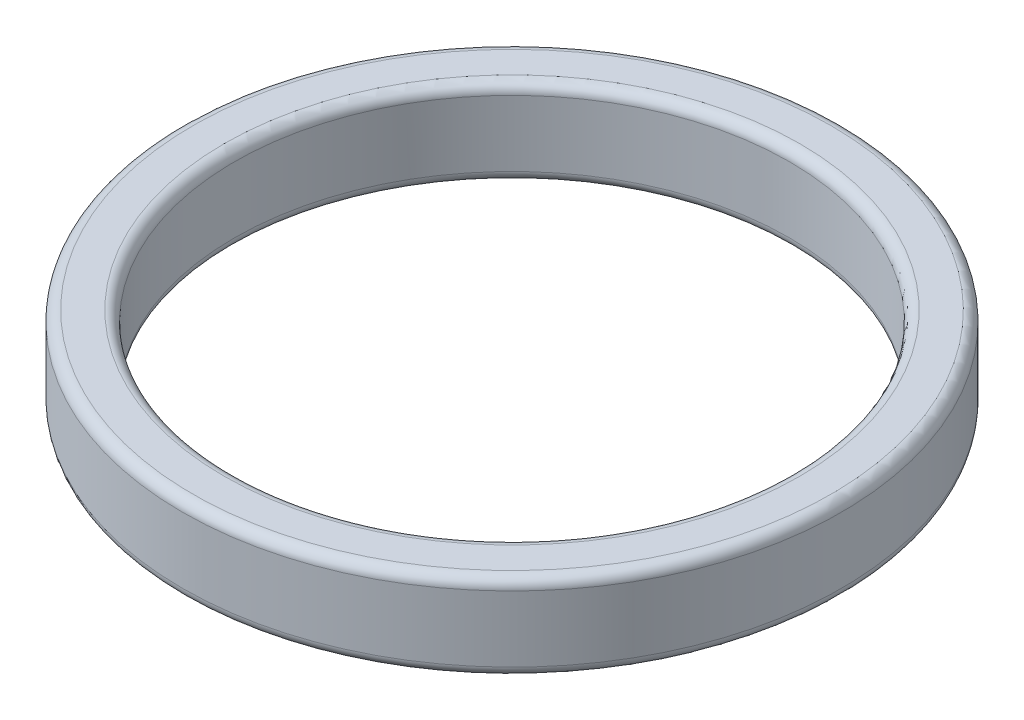
ISO-10303-21;
HEADER;
FILE_DESCRIPTION(('STEP AP214'),'2;1');
FILE_NAME('part.step','',(''),(''),'','','');
FILE_SCHEMA(('AUTOMOTIVE_DESIGN { 1 0 10303 214 1 1 1 1 }'));
ENDSEC;
DATA;
#1=APPLICATION_CONTEXT('core data for automotive mechanical design processes');
#2=APPLICATION_PROTOCOL_DEFINITION('international standard','automotive_design',2000,#1);
#3=PRODUCT_CONTEXT('',#1,'mechanical');
#4=PRODUCT('Part','Part','',(#3));
#5=PRODUCT_RELATED_PRODUCT_CATEGORY('part','',(#4));
#6=PRODUCT_DEFINITION_FORMATION('','',#4);
#7=PRODUCT_DEFINITION_CONTEXT('part definition',#1,'design');
#8=PRODUCT_DEFINITION('design','',#6,#7);
#9=PRODUCT_DEFINITION_SHAPE('','',#8);
#10=(LENGTH_UNIT() NAMED_UNIT(*) SI_UNIT(.MILLI.,.METRE.));
#11=(NAMED_UNIT(*) PLANE_ANGLE_UNIT() SI_UNIT($,.RADIAN.));
#12=(NAMED_UNIT(*) SI_UNIT($,.STERADIAN.) SOLID_ANGLE_UNIT());
#13=UNCERTAINTY_MEASURE_WITH_UNIT(LENGTH_MEASURE(1.E-05),#10,'distance_accuracy_value','');
#14=(GEOMETRIC_REPRESENTATION_CONTEXT(3) GLOBAL_UNCERTAINTY_ASSIGNED_CONTEXT((#13)) GLOBAL_UNIT_ASSIGNED_CONTEXT((#10,
#11,#12)) REPRESENTATION_CONTEXT('',''));
#15=CARTESIAN_POINT('',(0.,0.,0.));
#16=DIRECTION('',(0.,0.,1.));
#17=DIRECTION('',(1.,0.,0.));
#18=AXIS2_PLACEMENT_3D('',#15,#16,#17);
#19=CARTESIAN_POINT('',(0.,0.,0.));
#20=DIRECTION('',(0.,-1.,0.));
#21=DIRECTION('',(0.,0.,-1.));
#22=AXIS2_PLACEMENT_3D('',#19,#20,#21);
#23=CYLINDRICAL_SURFACE('',#22,9.5);
#24=CARTESIAN_POINT('',(0.,0.3,0.));
#25=DIRECTION('',(0.,1.,0.));
#26=DIRECTION('',(0.,0.,1.));
#27=AXIS2_PLACEMENT_3D('',#24,#25,#26);
#28=CIRCLE('',#27,9.5);
#29=CARTESIAN_POINT('',(0.,0.3,9.5));
#30=VERTEX_POINT('',#29);
#31=EDGE_CURVE('E57',#30,#30,#28,.T.);
#32=ORIENTED_EDGE('',*,*,#31,.T.);
#33=EDGE_LOOP('',(#32));
#34=FACE_BOUND('',#33,.T.);
#35=CARTESIAN_POINT('',(0.,2.2,0.));
#36=DIRECTION('',(0.,-1.,0.));
#37=DIRECTION('',(0.,0.,-1.));
#38=AXIS2_PLACEMENT_3D('',#35,#36,#37);
#39=CIRCLE('',#38,9.5);
#40=CARTESIAN_POINT('',(0.,2.2,-9.5));
#41=VERTEX_POINT('',#40);
#42=EDGE_CURVE('E60',#41,#41,#39,.T.);
#43=ORIENTED_EDGE('',*,*,#42,.T.);
#44=EDGE_LOOP('',(#43));
#45=FACE_BOUND('',#44,.T.);
#46=ADVANCED_FACE('F37',(#34,#45),#23,.T.);
#47=CARTESIAN_POINT('',(-9.5,0.,0.));
#48=DIRECTION('',(0.,1.,0.));
#49=DIRECTION('',(0.,0.,1.));
#50=AXIS2_PLACEMENT_3D('',#47,#48,#49);
#51=PLANE('',#50);
#52=CARTESIAN_POINT('',(0.,0.,0.));
#53=DIRECTION('',(0.,1.,0.));
#54=DIRECTION('',(0.,0.,1.));
#55=AXIS2_PLACEMENT_3D('',#52,#53,#54);
#56=CIRCLE('',#55,9.2);
#57=CARTESIAN_POINT('',(0.,0.,9.2));
#58=VERTEX_POINT('',#57);
#59=EDGE_CURVE('E63',#58,#58,#56,.F.);
#60=ORIENTED_EDGE('',*,*,#59,.T.);
#61=EDGE_LOOP('',(#60));
#62=FACE_BOUND('',#61,.T.);
#63=CARTESIAN_POINT('',(0.,0.,0.));
#64=DIRECTION('',(0.,1.,0.));
#65=DIRECTION('',(0.,0.,1.));
#66=AXIS2_PLACEMENT_3D('',#63,#64,#65);
#67=CIRCLE('',#66,8.3);
#68=CARTESIAN_POINT('',(0.,0.,8.3));
#69=VERTEX_POINT('',#68);
#70=EDGE_CURVE('E66',#69,#69,#67,.T.);
#71=ORIENTED_EDGE('',*,*,#70,.T.);
#72=EDGE_LOOP('',(#71));
#73=FACE_BOUND('',#72,.T.);
#74=ADVANCED_FACE('F70',(#62,#73),#51,.F.);
#75=CARTESIAN_POINT('',(0.,0.,0.));
#76=DIRECTION('',(0.,-1.,0.));
#77=DIRECTION('',(0.,0.,-1.));
#78=AXIS2_PLACEMENT_3D('',#75,#76,#77);
#79=CYLINDRICAL_SURFACE('',#78,8.);
#80=CARTESIAN_POINT('',(0.,0.3,0.));
#81=DIRECTION('',(0.,1.,0.));
#82=DIRECTION('',(0.,0.,1.));
#83=AXIS2_PLACEMENT_3D('',#80,#81,#82);
#84=CIRCLE('',#83,8.);
#85=CARTESIAN_POINT('',(0.,0.3,8.));
#86=VERTEX_POINT('',#85);
#87=EDGE_CURVE('E48',#86,#86,#84,.F.);
#88=ORIENTED_EDGE('',*,*,#87,.T.);
#89=EDGE_LOOP('',(#88));
#90=FACE_BOUND('',#89,.T.);
#91=CARTESIAN_POINT('',(0.,2.2,0.));
#92=DIRECTION('',(0.,-1.,0.));
#93=DIRECTION('',(0.,0.,-1.));
#94=AXIS2_PLACEMENT_3D('',#91,#92,#93);
#95=CIRCLE('',#94,8.);
#96=CARTESIAN_POINT('',(0.,2.2,-8.));
#97=VERTEX_POINT('',#96);
#98=EDGE_CURVE('E52',#97,#97,#95,.F.);
#99=ORIENTED_EDGE('',*,*,#98,.T.);
#100=EDGE_LOOP('',(#99));
#101=FACE_BOUND('',#100,.T.);
#102=ADVANCED_FACE('F80',(#90,#101),#79,.F.);
#103=CARTESIAN_POINT('',(-9.5,2.5,0.));
#104=DIRECTION('',(0.,-1.,0.));
#105=DIRECTION('',(0.,0.,-1.));
#106=AXIS2_PLACEMENT_3D('',#103,#104,#105);
#107=PLANE('',#106);
#108=CARTESIAN_POINT('',(0.,2.5,0.));
#109=DIRECTION('',(0.,-1.,0.));
#110=DIRECTION('',(0.,0.,-1.));
#111=AXIS2_PLACEMENT_3D('',#108,#109,#110);
#112=CIRCLE('',#111,9.2);
#113=CARTESIAN_POINT('',(0.,2.5,-9.2));
#114=VERTEX_POINT('',#113);
#115=EDGE_CURVE('E10',#114,#114,#112,.F.);
#116=ORIENTED_EDGE('',*,*,#115,.T.);
#117=EDGE_LOOP('',(#116));
#118=FACE_BOUND('',#117,.T.);
#119=CARTESIAN_POINT('',(0.,2.5,0.));
#120=DIRECTION('',(0.,-1.,0.));
#121=DIRECTION('',(0.,0.,-1.));
#122=AXIS2_PLACEMENT_3D('',#119,#120,#121);
#123=CIRCLE('',#122,8.3);
#124=CARTESIAN_POINT('',(0.,2.5,-8.3));
#125=VERTEX_POINT('',#124);
#126=EDGE_CURVE('E44',#125,#125,#123,.T.);
#127=ORIENTED_EDGE('',*,*,#126,.T.);
#128=EDGE_LOOP('',(#127));
#129=FACE_BOUND('',#128,.T.);
#130=ADVANCED_FACE('F83',(#118,#129),#107,.F.);
#131=CARTESIAN_POINT('',(0.,0.3,0.));
#132=DIRECTION('',(0.,1.,0.));
#133=DIRECTION('',(0.,0.,1.));
#134=AXIS2_PLACEMENT_3D('',#131,#132,#133);
#135=TOROIDAL_SURFACE('',#134,9.2,0.3);
#136=ORIENTED_EDGE('',*,*,#31,.F.);
#137=EDGE_LOOP('',(#136));
#138=FACE_BOUND('',#137,.T.);
#139=ORIENTED_EDGE('',*,*,#59,.F.);
#140=EDGE_LOOP('',(#139));
#141=FACE_BOUND('',#140,.T.);
#142=ADVANCED_FACE('F76',(#138,#141),#135,.T.);
#143=CARTESIAN_POINT('',(0.,0.3,0.));
#144=DIRECTION('',(0.,1.,0.));
#145=DIRECTION('',(0.,0.,1.));
#146=AXIS2_PLACEMENT_3D('',#143,#144,#145);
#147=TOROIDAL_SURFACE('',#146,8.3,0.3);
#148=ORIENTED_EDGE('',*,*,#70,.F.);
#149=EDGE_LOOP('',(#148));
#150=FACE_BOUND('',#149,.T.);
#151=ORIENTED_EDGE('',*,*,#87,.F.);
#152=EDGE_LOOP('',(#151));
#153=FACE_BOUND('',#152,.T.);
#154=ADVANCED_FACE('F72',(#150,#153),#147,.T.);
#155=CARTESIAN_POINT('',(0.,2.2,0.));
#156=DIRECTION('',(0.,-1.,0.));
#157=DIRECTION('',(0.,0.,-1.));
#158=AXIS2_PLACEMENT_3D('',#155,#156,#157);
#159=TOROIDAL_SURFACE('',#158,9.2,0.3);
#160=ORIENTED_EDGE('',*,*,#115,.F.);
#161=EDGE_LOOP('',(#160));
#162=FACE_BOUND('',#161,.T.);
#163=ORIENTED_EDGE('',*,*,#42,.F.);
#164=EDGE_LOOP('',(#163));
#165=FACE_BOUND('',#164,.T.);
#166=ADVANCED_FACE('F75',(#162,#165),#159,.T.);
#167=CARTESIAN_POINT('',(0.,2.2,0.));
#168=DIRECTION('',(0.,-1.,0.));
#169=DIRECTION('',(0.,0.,-1.));
#170=AXIS2_PLACEMENT_3D('',#167,#168,#169);
#171=TOROIDAL_SURFACE('',#170,8.3,0.3);
#172=ORIENTED_EDGE('',*,*,#98,.F.);
#173=EDGE_LOOP('',(#172));
#174=FACE_BOUND('',#173,.T.);
#175=ORIENTED_EDGE('',*,*,#126,.F.);
#176=EDGE_LOOP('',(#175));
#177=FACE_BOUND('',#176,.T.);
#178=ADVANCED_FACE('F39',(#174,#177),#171,.T.);
#179=CLOSED_SHELL('',(#46,#74,#102,#130,#142,#154,#166,#178));
#180=MANIFOLD_SOLID_BREP('B2',#179);
#181=ADVANCED_BREP_SHAPE_REPRESENTATION('',(#18,#180),#14);
#182=SHAPE_DEFINITION_REPRESENTATION(#9,#181);
ENDSEC;
END-ISO-10303-21;
